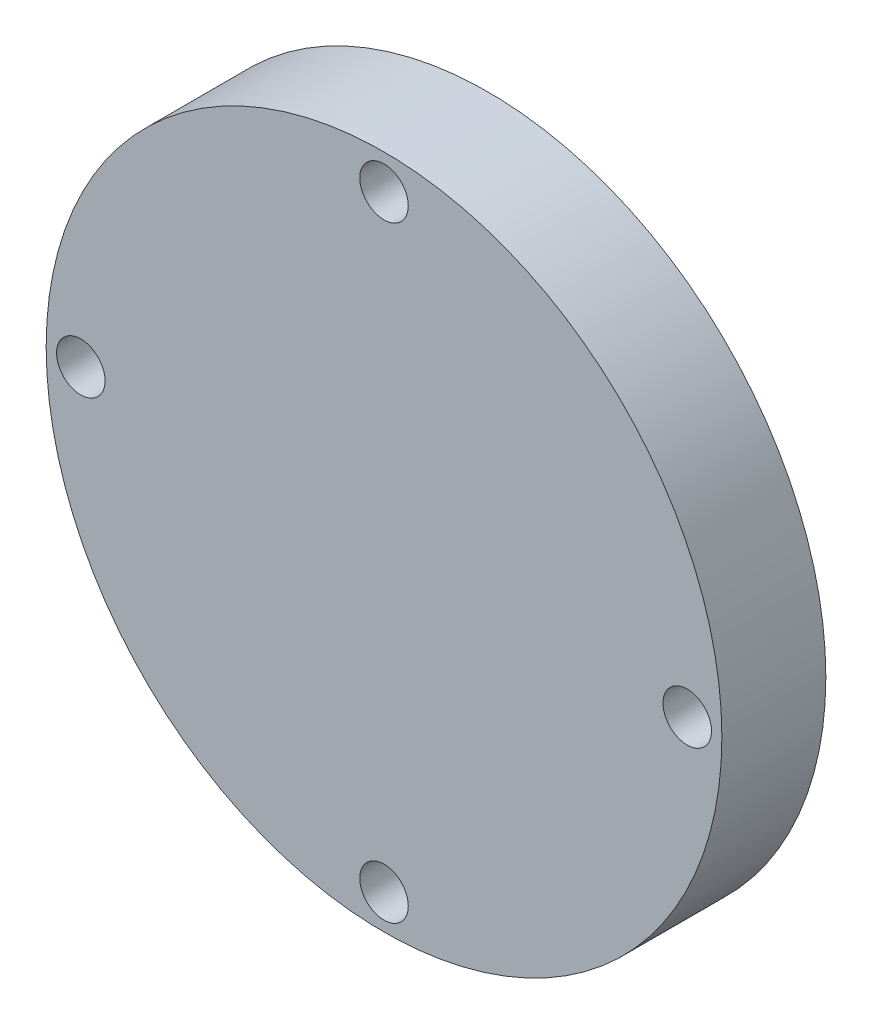
ISO-10303-21;
HEADER;
FILE_DESCRIPTION(('STEP AP214'),'2;1');
FILE_NAME('part.step','',(''),(''),'','','');
FILE_SCHEMA(('AUTOMOTIVE_DESIGN { 1 0 10303 214 1 1 1 1 }'));
ENDSEC;
DATA;
#1=APPLICATION_CONTEXT('core data for automotive mechanical design processes');
#2=APPLICATION_PROTOCOL_DEFINITION('international standard','automotive_design',2000,#1);
#3=PRODUCT_CONTEXT('',#1,'mechanical');
#4=PRODUCT('Part','Part','',(#3));
#5=PRODUCT_RELATED_PRODUCT_CATEGORY('part','',(#4));
#6=PRODUCT_DEFINITION_FORMATION('','',#4);
#7=PRODUCT_DEFINITION_CONTEXT('part definition',#1,'design');
#8=PRODUCT_DEFINITION('design','',#6,#7);
#9=PRODUCT_DEFINITION_SHAPE('','',#8);
#10=(LENGTH_UNIT() NAMED_UNIT(*) SI_UNIT(.MILLI.,.METRE.));
#11=(NAMED_UNIT(*) PLANE_ANGLE_UNIT() SI_UNIT($,.RADIAN.));
#12=(NAMED_UNIT(*) SI_UNIT($,.STERADIAN.) SOLID_ANGLE_UNIT());
#13=UNCERTAINTY_MEASURE_WITH_UNIT(LENGTH_MEASURE(1.E-05),#10,'distance_accuracy_value','');
#14=(GEOMETRIC_REPRESENTATION_CONTEXT(3) GLOBAL_UNCERTAINTY_ASSIGNED_CONTEXT((#13)) GLOBAL_UNIT_ASSIGNED_CONTEXT((#10,
#11,#12)) REPRESENTATION_CONTEXT('',''));
#15=CARTESIAN_POINT('',(0.,0.,0.));
#16=DIRECTION('',(0.,0.,1.));
#17=DIRECTION('',(1.,0.,0.));
#18=AXIS2_PLACEMENT_3D('',#15,#16,#17);
#19=CARTESIAN_POINT('',(25.8972903994125,31.4947345789206,6.));
#20=DIRECTION('',(0.,0.,-1.));
#21=DIRECTION('',(-1.,0.,0.));
#22=AXIS2_PLACEMENT_3D('',#19,#20,#21);
#23=CYLINDRICAL_SURFACE('',#22,1.4);
#24=CARTESIAN_POINT('',(25.8972903994125,31.4947345789206,6.));
#25=DIRECTION('',(0.,0.,1.));
#26=DIRECTION('',(1.,0.,0.));
#27=AXIS2_PLACEMENT_3D('',#24,#25,#26);
#28=CIRCLE('',#27,1.4);
#29=CARTESIAN_POINT('',(27.2972903994125,31.4947345789206,6.));
#30=VERTEX_POINT('',#29);
#31=EDGE_CURVE('E39',#30,#30,#28,.T.);
#32=ORIENTED_EDGE('',*,*,#31,.T.);
#33=EDGE_LOOP('',(#32));
#34=FACE_BOUND('',#33,.T.);
#35=CARTESIAN_POINT('',(25.8972903994125,31.4947345789206,0.));
#36=DIRECTION('',(0.,0.,1.));
#37=DIRECTION('',(1.,0.,0.));
#38=AXIS2_PLACEMENT_3D('',#35,#36,#37);
#39=CIRCLE('',#38,1.4);
#40=CARTESIAN_POINT('',(27.2972903994125,31.4947345789206,0.));
#41=VERTEX_POINT('',#40);
#42=EDGE_CURVE('E56',#41,#41,#39,.T.);
#43=ORIENTED_EDGE('',*,*,#42,.F.);
#44=EDGE_LOOP('',(#43));
#45=FACE_BOUND('',#44,.T.);
#46=ADVANCED_FACE('F31',(#34,#45),#23,.F.);
#47=CARTESIAN_POINT('',(8.39729039941249,13.9947345789204,6.));
#48=DIRECTION('',(0.,0.,-1.));
#49=DIRECTION('',(-1.,0.,0.));
#50=AXIS2_PLACEMENT_3D('',#47,#48,#49);
#51=CYLINDRICAL_SURFACE('',#50,1.4);
#52=CARTESIAN_POINT('',(8.39729039941249,13.9947345789204,6.));
#53=DIRECTION('',(0.,0.,1.));
#54=DIRECTION('',(1.,0.,0.));
#55=AXIS2_PLACEMENT_3D('',#52,#53,#54);
#56=CIRCLE('',#55,1.4);
#57=CARTESIAN_POINT('',(9.79729039941249,13.9947345789204,6.));
#58=VERTEX_POINT('',#57);
#59=EDGE_CURVE('E44',#58,#58,#56,.T.);
#60=ORIENTED_EDGE('',*,*,#59,.T.);
#61=EDGE_LOOP('',(#60));
#62=FACE_BOUND('',#61,.T.);
#63=CARTESIAN_POINT('',(8.39729039941249,13.9947345789204,0.));
#64=DIRECTION('',(0.,0.,1.));
#65=DIRECTION('',(1.,0.,0.));
#66=AXIS2_PLACEMENT_3D('',#63,#64,#65);
#67=CIRCLE('',#66,1.4);
#68=CARTESIAN_POINT('',(9.79729039941249,13.9947345789204,0.));
#69=VERTEX_POINT('',#68);
#70=EDGE_CURVE('E54',#69,#69,#67,.T.);
#71=ORIENTED_EDGE('',*,*,#70,.F.);
#72=EDGE_LOOP('',(#71));
#73=FACE_BOUND('',#72,.T.);
#74=ADVANCED_FACE('F74',(#62,#73),#51,.F.);
#75=CARTESIAN_POINT('',(-9.10270960058751,31.4947345789204,6.));
#76=DIRECTION('',(0.,0.,-1.));
#77=DIRECTION('',(-1.,0.,0.));
#78=AXIS2_PLACEMENT_3D('',#75,#76,#77);
#79=CYLINDRICAL_SURFACE('',#78,1.4);
#80=CARTESIAN_POINT('',(-9.10270960058751,31.4947345789204,6.));
#81=DIRECTION('',(0.,0.,1.));
#82=DIRECTION('',(1.,0.,0.));
#83=AXIS2_PLACEMENT_3D('',#80,#81,#82);
#84=CIRCLE('',#83,1.4);
#85=CARTESIAN_POINT('',(-7.70270960058751,31.4947345789204,6.));
#86=VERTEX_POINT('',#85);
#87=EDGE_CURVE('E65',#86,#86,#84,.T.);
#88=ORIENTED_EDGE('',*,*,#87,.T.);
#89=EDGE_LOOP('',(#88));
#90=FACE_BOUND('',#89,.T.);
#91=CARTESIAN_POINT('',(-9.10270960058751,31.4947345789204,0.));
#92=DIRECTION('',(0.,0.,1.));
#93=DIRECTION('',(1.,0.,0.));
#94=AXIS2_PLACEMENT_3D('',#91,#92,#93);
#95=CIRCLE('',#94,1.4);
#96=CARTESIAN_POINT('',(-7.70270960058751,31.4947345789204,0.));
#97=VERTEX_POINT('',#96);
#98=EDGE_CURVE('E51',#97,#97,#95,.T.);
#99=ORIENTED_EDGE('',*,*,#98,.F.);
#100=EDGE_LOOP('',(#99));
#101=FACE_BOUND('',#100,.T.);
#102=ADVANCED_FACE('F92',(#90,#101),#79,.F.);
#103=CARTESIAN_POINT('',(8.39729039941249,48.9947345789204,6.));
#104=DIRECTION('',(0.,0.,-1.));
#105=DIRECTION('',(-1.,0.,0.));
#106=AXIS2_PLACEMENT_3D('',#103,#104,#105);
#107=CYLINDRICAL_SURFACE('',#106,1.4);
#108=CARTESIAN_POINT('',(8.39729039941249,48.9947345789204,6.));
#109=DIRECTION('',(0.,0.,1.));
#110=DIRECTION('',(1.,0.,0.));
#111=AXIS2_PLACEMENT_3D('',#108,#109,#110);
#112=CIRCLE('',#111,1.4);
#113=CARTESIAN_POINT('',(9.79729039941249,48.9947345789204,6.));
#114=VERTEX_POINT('',#113);
#115=EDGE_CURVE('E61',#114,#114,#112,.T.);
#116=ORIENTED_EDGE('',*,*,#115,.T.);
#117=EDGE_LOOP('',(#116));
#118=FACE_BOUND('',#117,.T.);
#119=CARTESIAN_POINT('',(8.39729039941249,48.9947345789204,0.));
#120=DIRECTION('',(0.,0.,1.));
#121=DIRECTION('',(1.,0.,0.));
#122=AXIS2_PLACEMENT_3D('',#119,#120,#121);
#123=CIRCLE('',#122,1.4);
#124=CARTESIAN_POINT('',(9.79729039941249,48.9947345789204,0.));
#125=VERTEX_POINT('',#124);
#126=EDGE_CURVE('E48',#125,#125,#123,.T.);
#127=ORIENTED_EDGE('',*,*,#126,.F.);
#128=EDGE_LOOP('',(#127));
#129=FACE_BOUND('',#128,.T.);
#130=ADVANCED_FACE('F33',(#118,#129),#107,.F.);
#131=CARTESIAN_POINT('',(8.39729039941249,31.4947345789204,6.));
#132=DIRECTION('',(0.,0.,-1.));
#133=DIRECTION('',(-1.,0.,0.));
#134=AXIS2_PLACEMENT_3D('',#131,#132,#133);
#135=CYLINDRICAL_SURFACE('',#134,19.5);
#136=CARTESIAN_POINT('',(8.39729039941249,31.4947345789204,6.));
#137=DIRECTION('',(0.,0.,1.));
#138=DIRECTION('',(1.,0.,0.));
#139=AXIS2_PLACEMENT_3D('',#136,#137,#138);
#140=CIRCLE('',#139,19.5);
#141=CARTESIAN_POINT('',(27.8972903994125,31.4947345789204,6.));
#142=VERTEX_POINT('',#141);
#143=EDGE_CURVE('E10',#142,#142,#140,.T.);
#144=ORIENTED_EDGE('',*,*,#143,.F.);
#145=EDGE_LOOP('',(#144));
#146=FACE_BOUND('',#145,.T.);
#147=CARTESIAN_POINT('',(8.39729039941249,31.4947345789204,0.));
#148=DIRECTION('',(0.,0.,1.));
#149=DIRECTION('',(1.,0.,0.));
#150=AXIS2_PLACEMENT_3D('',#147,#148,#149);
#151=CIRCLE('',#150,19.5);
#152=CARTESIAN_POINT('',(27.8972903994125,31.4947345789204,0.));
#153=VERTEX_POINT('',#152);
#154=EDGE_CURVE('E35',#153,#153,#151,.T.);
#155=ORIENTED_EDGE('',*,*,#154,.T.);
#156=EDGE_LOOP('',(#155));
#157=FACE_BOUND('',#156,.T.);
#158=ADVANCED_FACE('F81',(#146,#157),#135,.T.);
#159=CARTESIAN_POINT('',(0.,0.,6.));
#160=DIRECTION('',(0.,0.,1.));
#161=DIRECTION('',(1.,0.,0.));
#162=AXIS2_PLACEMENT_3D('',#159,#160,#161);
#163=PLANE('',#162);
#164=ORIENTED_EDGE('',*,*,#115,.F.);
#165=EDGE_LOOP('',(#164));
#166=FACE_BOUND('',#165,.T.);
#167=ORIENTED_EDGE('',*,*,#87,.F.);
#168=EDGE_LOOP('',(#167));
#169=FACE_BOUND('',#168,.T.);
#170=ORIENTED_EDGE('',*,*,#59,.F.);
#171=EDGE_LOOP('',(#170));
#172=FACE_BOUND('',#171,.T.);
#173=ORIENTED_EDGE('',*,*,#31,.F.);
#174=EDGE_LOOP('',(#173));
#175=FACE_BOUND('',#174,.T.);
#176=ORIENTED_EDGE('',*,*,#143,.T.);
#177=EDGE_LOOP('',(#176));
#178=FACE_BOUND('',#177,.T.);
#179=ADVANCED_FACE('F77',(#166,#169,#172,#175,#178),#163,.T.);
#180=CARTESIAN_POINT('',(0.,0.,0.));
#181=DIRECTION('',(0.,0.,1.));
#182=DIRECTION('',(1.,0.,0.));
#183=AXIS2_PLACEMENT_3D('',#180,#181,#182);
#184=PLANE('',#183);
#185=ORIENTED_EDGE('',*,*,#126,.T.);
#186=EDGE_LOOP('',(#185));
#187=FACE_BOUND('',#186,.T.);
#188=ORIENTED_EDGE('',*,*,#98,.T.);
#189=EDGE_LOOP('',(#188));
#190=FACE_BOUND('',#189,.T.);
#191=ORIENTED_EDGE('',*,*,#70,.T.);
#192=EDGE_LOOP('',(#191));
#193=FACE_BOUND('',#192,.T.);
#194=ORIENTED_EDGE('',*,*,#42,.T.);
#195=EDGE_LOOP('',(#194));
#196=FACE_BOUND('',#195,.T.);
#197=ORIENTED_EDGE('',*,*,#154,.F.);
#198=EDGE_LOOP('',(#197));
#199=FACE_BOUND('',#198,.T.);
#200=ADVANCED_FACE('F80',(#187,#190,#193,#196,#199),#184,.F.);
#201=CLOSED_SHELL('',(#46,#74,#102,#130,#158,#179,#200));
#202=MANIFOLD_SOLID_BREP('B2',#201);
#203=ADVANCED_BREP_SHAPE_REPRESENTATION('',(#18,#202),#14);
#204=SHAPE_DEFINITION_REPRESENTATION(#9,#203);
ENDSEC;
END-ISO-10303-21;
